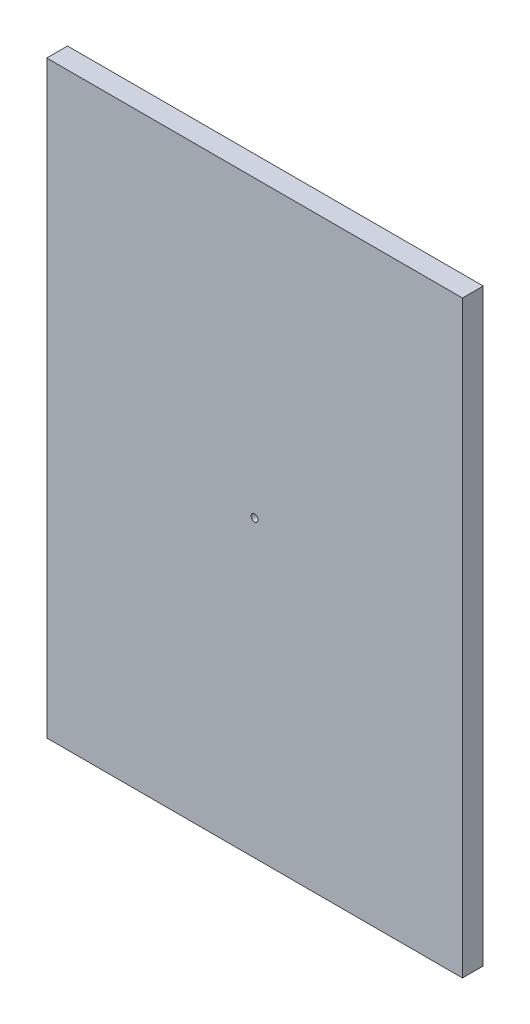
ISO-10303-21;
HEADER;
FILE_DESCRIPTION(('STEP AP214'),'2;1');
FILE_NAME('part.step','',(''),(''),'','','');
FILE_SCHEMA(('AUTOMOTIVE_DESIGN { 1 0 10303 214 1 1 1 1 }'));
ENDSEC;
DATA;
#1=APPLICATION_CONTEXT('core data for automotive mechanical design processes');
#2=APPLICATION_PROTOCOL_DEFINITION('international standard','automotive_design',2000,#1);
#3=PRODUCT_CONTEXT('',#1,'mechanical');
#4=PRODUCT('Part','Part','',(#3));
#5=PRODUCT_RELATED_PRODUCT_CATEGORY('part','',(#4));
#6=PRODUCT_DEFINITION_FORMATION('','',#4);
#7=PRODUCT_DEFINITION_CONTEXT('part definition',#1,'design');
#8=PRODUCT_DEFINITION('design','',#6,#7);
#9=PRODUCT_DEFINITION_SHAPE('','',#8);
#10=(LENGTH_UNIT() NAMED_UNIT(*) SI_UNIT(.MILLI.,.METRE.));
#11=(NAMED_UNIT(*) PLANE_ANGLE_UNIT() SI_UNIT($,.RADIAN.));
#12=(NAMED_UNIT(*) SI_UNIT($,.STERADIAN.) SOLID_ANGLE_UNIT());
#13=UNCERTAINTY_MEASURE_WITH_UNIT(LENGTH_MEASURE(1.E-05),#10,'distance_accuracy_value','');
#14=(GEOMETRIC_REPRESENTATION_CONTEXT(3) GLOBAL_UNCERTAINTY_ASSIGNED_CONTEXT((#13)) GLOBAL_UNIT_ASSIGNED_CONTEXT((#10,
#11,#12)) REPRESENTATION_CONTEXT('',''));
#15=CARTESIAN_POINT('',(0.,0.,0.));
#16=DIRECTION('',(0.,0.,1.));
#17=DIRECTION('',(1.,0.,0.));
#18=AXIS2_PLACEMENT_3D('',#15,#16,#17);
#19=CARTESIAN_POINT('',(60.,0.,3.));
#20=DIRECTION('',(1.,0.,0.));
#21=DIRECTION('',(0.,1.,0.));
#22=AXIS2_PLACEMENT_3D('',#19,#20,#21);
#23=PLANE('',#22);
#24=DIRECTION('',(0.,-1.,0.));
#25=VECTOR('',#24,1.);
#26=CARTESIAN_POINT('',(60.,0.,0.));
#27=LINE('',#26,#25);
#28=CARTESIAN_POINT('',(60.,0.,0.));
#29=VERTEX_POINT('',#28);
#30=CARTESIAN_POINT('',(60.,-85.,0.));
#31=VERTEX_POINT('',#30);
#32=EDGE_CURVE('E109',#29,#31,#27,.T.);
#33=ORIENTED_EDGE('',*,*,#32,.F.);
#34=DIRECTION('',(0.,0.,-1.));
#35=VECTOR('',#34,1.);
#36=CARTESIAN_POINT('',(60.,0.,3.));
#37=LINE('',#36,#35);
#38=CARTESIAN_POINT('',(60.,0.,3.));
#39=VERTEX_POINT('',#38);
#40=EDGE_CURVE('E11',#39,#29,#37,.T.);
#41=ORIENTED_EDGE('',*,*,#40,.F.);
#42=DIRECTION('',(0.,-1.,0.));
#43=VECTOR('',#42,1.);
#44=CARTESIAN_POINT('',(60.,0.,3.));
#45=LINE('',#44,#43);
#46=CARTESIAN_POINT('',(60.,-85.,3.));
#47=VERTEX_POINT('',#46);
#48=EDGE_CURVE('E99',#39,#47,#45,.T.);
#49=ORIENTED_EDGE('',*,*,#48,.T.);
#50=DIRECTION('',(0.,0.,-1.));
#51=VECTOR('',#50,1.);
#52=CARTESIAN_POINT('',(60.,-85.,3.));
#53=LINE('',#52,#51);
#54=EDGE_CURVE('E78',#47,#31,#53,.T.);
#55=ORIENTED_EDGE('',*,*,#54,.T.);
#56=EDGE_LOOP('',(#33,#41,#49,#55));
#57=FACE_BOUND('',#56,.T.);
#58=ADVANCED_FACE('F38',(#57),#23,.T.);
#59=CARTESIAN_POINT('',(0.,0.,3.));
#60=DIRECTION('',(0.,1.,0.));
#61=DIRECTION('',(0.,0.,1.));
#62=AXIS2_PLACEMENT_3D('',#59,#60,#61);
#63=PLANE('',#62);
#64=DIRECTION('',(1.,0.,0.));
#65=VECTOR('',#64,1.);
#66=CARTESIAN_POINT('',(0.,0.,0.));
#67=LINE('',#66,#65);
#68=CARTESIAN_POINT('',(0.,0.,0.));
#69=VERTEX_POINT('',#68);
#70=EDGE_CURVE('E90',#69,#29,#67,.T.);
#71=ORIENTED_EDGE('',*,*,#70,.F.);
#72=DIRECTION('',(0.,0.,-1.));
#73=VECTOR('',#72,1.);
#74=CARTESIAN_POINT('',(0.,0.,3.));
#75=LINE('',#74,#73);
#76=CARTESIAN_POINT('',(0.,0.,3.));
#77=VERTEX_POINT('',#76);
#78=EDGE_CURVE('E47',#77,#69,#75,.T.);
#79=ORIENTED_EDGE('',*,*,#78,.F.);
#80=DIRECTION('',(1.,0.,0.));
#81=VECTOR('',#80,1.);
#82=CARTESIAN_POINT('',(0.,0.,3.));
#83=LINE('',#82,#81);
#84=EDGE_CURVE('E88',#77,#39,#83,.T.);
#85=ORIENTED_EDGE('',*,*,#84,.T.);
#86=ORIENTED_EDGE('',*,*,#40,.T.);
#87=EDGE_LOOP('',(#71,#79,#85,#86));
#88=FACE_BOUND('',#87,.T.);
#89=ADVANCED_FACE('F86',(#88),#63,.T.);
#90=CARTESIAN_POINT('',(0.,0.,3.));
#91=DIRECTION('',(1.,0.,0.));
#92=DIRECTION('',(0.,1.,0.));
#93=AXIS2_PLACEMENT_3D('',#90,#91,#92);
#94=PLANE('',#93);
#95=DIRECTION('',(0.,-1.,0.));
#96=VECTOR('',#95,1.);
#97=CARTESIAN_POINT('',(0.,0.,0.));
#98=LINE('',#97,#96);
#99=CARTESIAN_POINT('',(0.,-85.,0.));
#100=VERTEX_POINT('',#99);
#101=EDGE_CURVE('E112',#69,#100,#98,.T.);
#102=ORIENTED_EDGE('',*,*,#101,.T.);
#103=DIRECTION('',(0.,0.,-1.));
#104=VECTOR('',#103,1.);
#105=CARTESIAN_POINT('',(0.,-85.,3.));
#106=LINE('',#105,#104);
#107=CARTESIAN_POINT('',(0.,-85.,3.));
#108=VERTEX_POINT('',#107);
#109=EDGE_CURVE('E93',#108,#100,#106,.T.);
#110=ORIENTED_EDGE('',*,*,#109,.F.);
#111=DIRECTION('',(0.,-1.,0.));
#112=VECTOR('',#111,1.);
#113=CARTESIAN_POINT('',(0.,0.,3.));
#114=LINE('',#113,#112);
#115=EDGE_CURVE('E95',#77,#108,#114,.T.);
#116=ORIENTED_EDGE('',*,*,#115,.F.);
#117=ORIENTED_EDGE('',*,*,#78,.T.);
#118=EDGE_LOOP('',(#102,#110,#116,#117));
#119=FACE_BOUND('',#118,.T.);
#120=ADVANCED_FACE('F96',(#119),#94,.F.);
#121=CARTESIAN_POINT('',(30.,-42.5,3.));
#122=DIRECTION('',(0.,0.,-1.));
#123=DIRECTION('',(-1.,0.,0.));
#124=AXIS2_PLACEMENT_3D('',#121,#122,#123);
#125=CYLINDRICAL_SURFACE('',#124,0.499999999999999);
#126=CARTESIAN_POINT('',(30.,-42.5,3.));
#127=DIRECTION('',(0.,0.,1.));
#128=DIRECTION('',(1.,0.,0.));
#129=AXIS2_PLACEMENT_3D('',#126,#127,#128);
#130=CIRCLE('',#129,0.499999999999999);
#131=CARTESIAN_POINT('',(30.5,-42.5,3.));
#132=VERTEX_POINT('',#131);
#133=EDGE_CURVE('E101',#132,#132,#130,.T.);
#134=ORIENTED_EDGE('',*,*,#133,.T.);
#135=EDGE_LOOP('',(#134));
#136=FACE_BOUND('',#135,.T.);
#137=CARTESIAN_POINT('',(30.,-42.5,0.));
#138=DIRECTION('',(0.,0.,1.));
#139=DIRECTION('',(1.,0.,0.));
#140=AXIS2_PLACEMENT_3D('',#137,#138,#139);
#141=CIRCLE('',#140,0.499999999999999);
#142=CARTESIAN_POINT('',(30.5,-42.5,0.));
#143=VERTEX_POINT('',#142);
#144=EDGE_CURVE('E106',#143,#143,#141,.T.);
#145=ORIENTED_EDGE('',*,*,#144,.F.);
#146=EDGE_LOOP('',(#145));
#147=FACE_BOUND('',#146,.T.);
#148=ADVANCED_FACE('F40',(#136,#147),#125,.F.);
#149=CARTESIAN_POINT('',(0.,-85.,3.));
#150=DIRECTION('',(0.,1.,0.));
#151=DIRECTION('',(0.,0.,1.));
#152=AXIS2_PLACEMENT_3D('',#149,#150,#151);
#153=PLANE('',#152);
#154=DIRECTION('',(1.,0.,0.));
#155=VECTOR('',#154,1.);
#156=CARTESIAN_POINT('',(0.,-85.,0.));
#157=LINE('',#156,#155);
#158=EDGE_CURVE('E71',#100,#31,#157,.T.);
#159=ORIENTED_EDGE('',*,*,#158,.T.);
#160=ORIENTED_EDGE('',*,*,#54,.F.);
#161=DIRECTION('',(1.,0.,0.));
#162=VECTOR('',#161,1.);
#163=CARTESIAN_POINT('',(0.,-85.,3.));
#164=LINE('',#163,#162);
#165=EDGE_CURVE('E55',#108,#47,#164,.T.);
#166=ORIENTED_EDGE('',*,*,#165,.F.);
#167=ORIENTED_EDGE('',*,*,#109,.T.);
#168=EDGE_LOOP('',(#159,#160,#166,#167));
#169=FACE_BOUND('',#168,.T.);
#170=ADVANCED_FACE('F117',(#169),#153,.F.);
#171=CARTESIAN_POINT('',(0.,0.,3.));
#172=DIRECTION('',(0.,0.,1.));
#173=DIRECTION('',(1.,0.,0.));
#174=AXIS2_PLACEMENT_3D('',#171,#172,#173);
#175=PLANE('',#174);
#176=ORIENTED_EDGE('',*,*,#133,.F.);
#177=EDGE_LOOP('',(#176));
#178=FACE_BOUND('',#177,.T.);
#179=ORIENTED_EDGE('',*,*,#48,.F.);
#180=ORIENTED_EDGE('',*,*,#84,.F.);
#181=ORIENTED_EDGE('',*,*,#115,.T.);
#182=ORIENTED_EDGE('',*,*,#165,.T.);
#183=EDGE_LOOP('',(#179,#180,#181,#182));
#184=FACE_BOUND('',#183,.T.);
#185=ADVANCED_FACE('F98',(#178,#184),#175,.T.);
#186=CARTESIAN_POINT('',(0.,0.,0.));
#187=DIRECTION('',(0.,0.,1.));
#188=DIRECTION('',(1.,0.,0.));
#189=AXIS2_PLACEMENT_3D('',#186,#187,#188);
#190=PLANE('',#189);
#191=ORIENTED_EDGE('',*,*,#144,.T.);
#192=EDGE_LOOP('',(#191));
#193=FACE_BOUND('',#192,.T.);
#194=ORIENTED_EDGE('',*,*,#32,.T.);
#195=ORIENTED_EDGE('',*,*,#158,.F.);
#196=ORIENTED_EDGE('',*,*,#101,.F.);
#197=ORIENTED_EDGE('',*,*,#70,.T.);
#198=EDGE_LOOP('',(#194,#195,#196,#197));
#199=FACE_BOUND('',#198,.T.);
#200=ADVANCED_FACE('F118',(#193,#199),#190,.F.);
#201=CLOSED_SHELL('',(#58,#89,#120,#148,#170,#185,#200));
#202=MANIFOLD_SOLID_BREP('B2',#201);
#203=ADVANCED_BREP_SHAPE_REPRESENTATION('',(#18,#202),#14);
#204=SHAPE_DEFINITION_REPRESENTATION(#9,#203);
ENDSEC;
END-ISO-10303-21;
